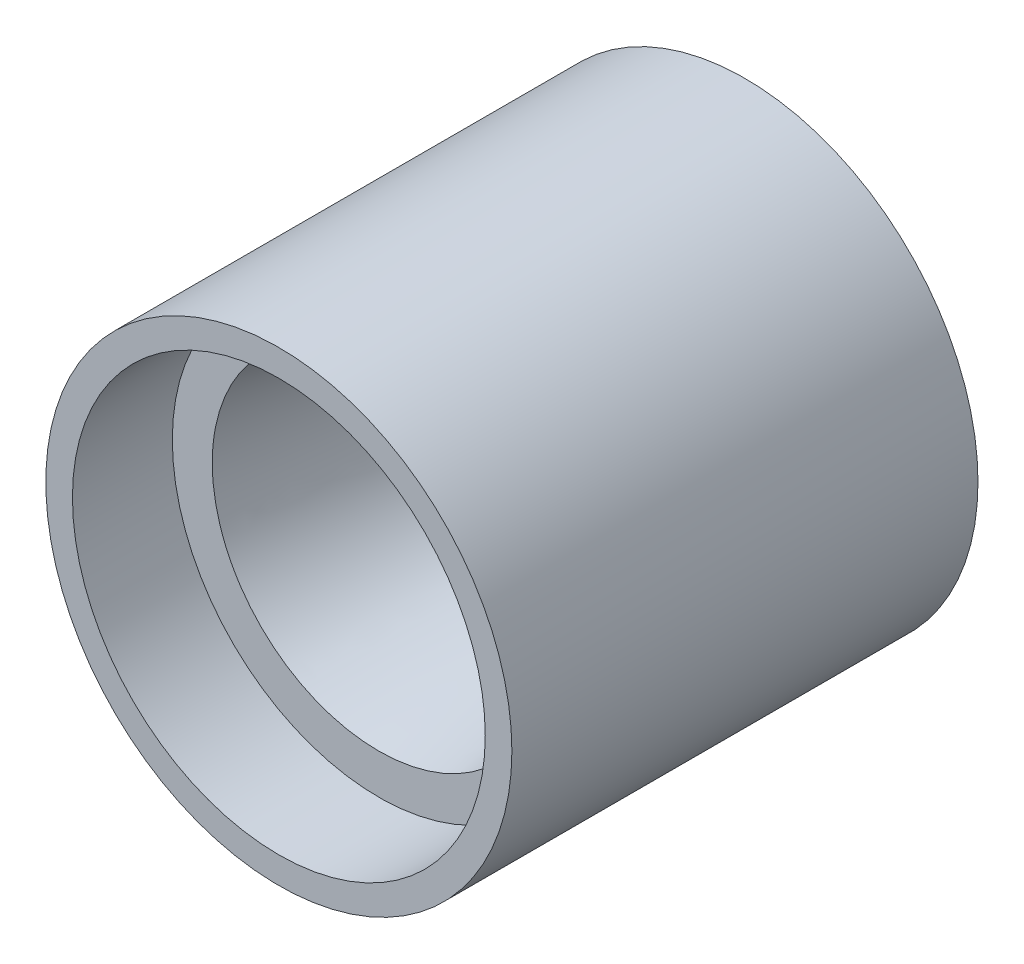
ISO-10303-21;
HEADER;
FILE_DESCRIPTION(('STEP AP214'),'2;1');
FILE_NAME('part.step','',(''),(''),'','','');
FILE_SCHEMA(('AUTOMOTIVE_DESIGN { 1 0 10303 214 1 1 1 1 }'));
ENDSEC;
DATA;
#1=APPLICATION_CONTEXT('core data for automotive mechanical design processes');
#2=APPLICATION_PROTOCOL_DEFINITION('international standard','automotive_design',2000,#1);
#3=PRODUCT_CONTEXT('',#1,'mechanical');
#4=PRODUCT('Part','Part','',(#3));
#5=PRODUCT_RELATED_PRODUCT_CATEGORY('part','',(#4));
#6=PRODUCT_DEFINITION_FORMATION('','',#4);
#7=PRODUCT_DEFINITION_CONTEXT('part definition',#1,'design');
#8=PRODUCT_DEFINITION('design','',#6,#7);
#9=PRODUCT_DEFINITION_SHAPE('','',#8);
#10=(LENGTH_UNIT() NAMED_UNIT(*) SI_UNIT(.MILLI.,.METRE.));
#11=(NAMED_UNIT(*) PLANE_ANGLE_UNIT() SI_UNIT($,.RADIAN.));
#12=(NAMED_UNIT(*) SI_UNIT($,.STERADIAN.) SOLID_ANGLE_UNIT());
#13=UNCERTAINTY_MEASURE_WITH_UNIT(LENGTH_MEASURE(1.E-05),#10,'distance_accuracy_value','');
#14=(GEOMETRIC_REPRESENTATION_CONTEXT(3) GLOBAL_UNCERTAINTY_ASSIGNED_CONTEXT((#13)) GLOBAL_UNIT_ASSIGNED_CONTEXT((#10,
#11,#12)) REPRESENTATION_CONTEXT('',''));
#15=CARTESIAN_POINT('',(0.,0.,0.));
#16=DIRECTION('',(0.,0.,1.));
#17=DIRECTION('',(1.,0.,0.));
#18=AXIS2_PLACEMENT_3D('',#15,#16,#17);
#19=CARTESIAN_POINT('',(0.,0.,70.));
#20=DIRECTION('',(0.,0.,-1.));
#21=DIRECTION('',(-1.,0.,0.));
#22=AXIS2_PLACEMENT_3D('',#19,#20,#21);
#23=CYLINDRICAL_SURFACE('',#22,31.);
#24=CARTESIAN_POINT('',(0.,0.,70.));
#25=DIRECTION('',(0.,0.,1.));
#26=DIRECTION('',(1.,0.,0.));
#27=AXIS2_PLACEMENT_3D('',#24,#25,#26);
#28=CIRCLE('',#27,31.);
#29=CARTESIAN_POINT('',(31.,0.,70.));
#30=VERTEX_POINT('',#29);
#31=EDGE_CURVE('E48',#30,#30,#28,.T.);
#32=ORIENTED_EDGE('',*,*,#31,.T.);
#33=EDGE_LOOP('',(#32));
#34=FACE_BOUND('',#33,.T.);
#35=CARTESIAN_POINT('',(0.,0.,55.));
#36=DIRECTION('',(0.,0.,-1.));
#37=DIRECTION('',(-1.,0.,0.));
#38=AXIS2_PLACEMENT_3D('',#35,#36,#37);
#39=CIRCLE('',#38,31.);
#40=CARTESIAN_POINT('',(-31.,0.,55.));
#41=VERTEX_POINT('',#40);
#42=EDGE_CURVE('E52',#41,#41,#39,.T.);
#43=ORIENTED_EDGE('',*,*,#42,.T.);
#44=EDGE_LOOP('',(#43));
#45=FACE_BOUND('',#44,.T.);
#46=ADVANCED_FACE('F37',(#34,#45),#23,.F.);
#47=CARTESIAN_POINT('',(0.,0.,70.));
#48=DIRECTION('',(0.,0.,1.));
#49=DIRECTION('',(1.,0.,0.));
#50=AXIS2_PLACEMENT_3D('',#47,#48,#49);
#51=PLANE('',#50);
#52=CARTESIAN_POINT('',(0.,0.,70.));
#53=DIRECTION('',(0.,0.,1.));
#54=DIRECTION('',(1.,0.,0.));
#55=AXIS2_PLACEMENT_3D('',#52,#53,#54);
#56=CIRCLE('',#55,35.);
#57=CARTESIAN_POINT('',(35.,0.,70.));
#58=VERTEX_POINT('',#57);
#59=EDGE_CURVE('E11',#58,#58,#56,.T.);
#60=ORIENTED_EDGE('',*,*,#59,.T.);
#61=EDGE_LOOP('',(#60));
#62=FACE_BOUND('',#61,.T.);
#63=ORIENTED_EDGE('',*,*,#31,.F.);
#64=EDGE_LOOP('',(#63));
#65=FACE_BOUND('',#64,.T.);
#66=ADVANCED_FACE('F72',(#62,#65),#51,.T.);
#67=CARTESIAN_POINT('',(0.,0.,0.));
#68=DIRECTION('',(0.,0.,1.));
#69=DIRECTION('',(1.,0.,0.));
#70=AXIS2_PLACEMENT_3D('',#67,#68,#69);
#71=PLANE('',#70);
#72=CARTESIAN_POINT('',(0.,0.,0.));
#73=DIRECTION('',(0.,0.,-1.));
#74=DIRECTION('',(-1.,0.,0.));
#75=AXIS2_PLACEMENT_3D('',#72,#73,#74);
#76=CIRCLE('',#75,19.05);
#77=CARTESIAN_POINT('',(10.5288124830174,15.8759758030005,0.));
#78=VERTEX_POINT('',#77);
#79=EDGE_CURVE('E56',#78,#78,#76,.T.);
#80=ORIENTED_EDGE('',*,*,#79,.F.);
#81=EDGE_LOOP('',(#80));
#82=FACE_BOUND('',#81,.T.);
#83=CARTESIAN_POINT('',(0.,0.,0.));
#84=DIRECTION('',(0.,0.,1.));
#85=DIRECTION('',(1.,0.,0.));
#86=AXIS2_PLACEMENT_3D('',#83,#84,#85);
#87=CIRCLE('',#86,35.);
#88=CARTESIAN_POINT('',(35.,0.,0.));
#89=VERTEX_POINT('',#88);
#90=EDGE_CURVE('E41',#89,#89,#87,.T.);
#91=ORIENTED_EDGE('',*,*,#90,.F.);
#92=EDGE_LOOP('',(#91));
#93=FACE_BOUND('',#92,.T.);
#94=ADVANCED_FACE('F78',(#82,#93),#71,.F.);
#95=CARTESIAN_POINT('',(0.,0.,70.));
#96=DIRECTION('',(0.,0.,-1.));
#97=DIRECTION('',(-1.,0.,0.));
#98=AXIS2_PLACEMENT_3D('',#95,#96,#97);
#99=CYLINDRICAL_SURFACE('',#98,35.);
#100=ORIENTED_EDGE('',*,*,#59,.F.);
#101=EDGE_LOOP('',(#100));
#102=FACE_BOUND('',#101,.T.);
#103=ORIENTED_EDGE('',*,*,#90,.T.);
#104=EDGE_LOOP('',(#103));
#105=FACE_BOUND('',#104,.T.);
#106=ADVANCED_FACE('F39',(#102,#105),#99,.T.);
#107=CARTESIAN_POINT('',(0.,0.,55.));
#108=DIRECTION('',(0.,0.,-1.));
#109=DIRECTION('',(-1.,0.,0.));
#110=AXIS2_PLACEMENT_3D('',#107,#108,#109);
#111=PLANE('',#110);
#112=CARTESIAN_POINT('',(0.,0.,55.));
#113=DIRECTION('',(0.,0.,1.));
#114=DIRECTION('',(1.,0.,0.));
#115=AXIS2_PLACEMENT_3D('',#112,#113,#114);
#116=CIRCLE('',#115,25.);
#117=CARTESIAN_POINT('',(24.5057438966427,4.94656608893074,55.));
#118=VERTEX_POINT('',#117);
#119=EDGE_CURVE('E55',#118,#118,#116,.T.);
#120=ORIENTED_EDGE('',*,*,#119,.F.);
#121=EDGE_LOOP('',(#120));
#122=FACE_BOUND('',#121,.T.);
#123=ORIENTED_EDGE('',*,*,#42,.F.);
#124=EDGE_LOOP('',(#123));
#125=FACE_BOUND('',#124,.T.);
#126=ADVANCED_FACE('F65',(#122,#125),#111,.F.);
#127=CARTESIAN_POINT('',(24.5057438966427,4.94656608893074,55.));
#128=CARTESIAN_POINT('',(10.5288124830174,15.8759758030005,0.));
#129=CARTESIAN_POINT('',(34.3988760745042,-44.0649217043547,55.));
#130=CARTESIAN_POINT('',(42.2807640890183,-5.18164916303433,0.));
#131=CARTESIAN_POINT('',(-14.6126117187812,-53.9580538822161,55.));
#132=CARTESIAN_POINT('',(21.2231391229836,-36.9336007690353,0.));
#133=CARTESIAN_POINT('',(-24.5057438966427,-4.94656608893072,55.));
#134=CARTESIAN_POINT('',(-10.5288124830174,-15.8759758030005,0.));
#135=CARTESIAN_POINT('',(-34.3988760745041,44.0649217043547,55.));
#136=CARTESIAN_POINT('',(-42.2807640890184,5.18164916303432,0.));
#137=CARTESIAN_POINT('',(14.6126117187812,53.9580538822161,55.));
#138=CARTESIAN_POINT('',(-21.2231391229836,36.9336007690353,0.));
#139=CARTESIAN_POINT('',(24.5057438966427,4.94656608893074,55.));
#140=CARTESIAN_POINT('',(10.5288124830174,15.8759758030005,0.));
#141=(BOUNDED_SURFACE() B_SPLINE_SURFACE(3,1,((#127,#128),(#129,#130),(#131,#132),(#133,#134),
(#135,#136),(#137,#138),(#139,#140)),.UNSPECIFIED.,.T.,.F.,.F.) B_SPLINE_SURFACE_WITH_KNOTS((4,
3,4),(2,2),(0.,0.5,1.),(0.,1.),
.UNSPECIFIED.) GEOMETRIC_REPRESENTATION_ITEM() RATIONAL_B_SPLINE_SURFACE(((1.,1.),
(0.333333333333333,0.333333333333334),(0.333333333333333,0.333333333333334),(1.,1.),
(0.333333333333333,0.333333333333333),(0.333333333333333,0.333333333333333),(1.,1.))) REPRESENTATION_ITEM('') SURFACE());
#142=CARTESIAN_POINT('',(24.5057438966427,4.94656608893074,55.));
#143=CARTESIAN_POINT('',(24.3601508610841,5.06041410678563,54.4270833333333));
#144=CARTESIAN_POINT('',(24.2145578255255,5.17426212464053,53.8541666666667));
#145=CARTESIAN_POINT('',(23.9233717544083,5.40195816035031,52.7083333333333));
#146=CARTESIAN_POINT('',(23.7777787188497,5.5158061782052,52.1354166666667));
#147=CARTESIAN_POINT('',(23.4865926477325,5.74350221391499,50.9895833333333));
#148=CARTESIAN_POINT('',(23.3409996121739,5.85735023176988,50.4166666666667));
#149=CARTESIAN_POINT('',(23.0498135410567,6.08504626747967,49.2708333333333));
#150=CARTESIAN_POINT('',(22.9042205054981,6.19889428533456,48.6979166666667));
#151=CARTESIAN_POINT('',(22.6130344343809,6.42659032104435,47.5520833333333));
#152=CARTESIAN_POINT('',(22.4674413988223,6.54043833889924,46.9791666666667));
#153=CARTESIAN_POINT('',(22.1762553277051,6.76813437460903,45.8333333333333));
#154=CARTESIAN_POINT('',(22.0306622921465,6.88198239246392,45.2604166666667));
#155=CARTESIAN_POINT('',(21.7394762210294,7.10967842817371,44.1145833333333));
#156=CARTESIAN_POINT('',(21.5938831854708,7.2235264460286,43.5416666666667));
#157=CARTESIAN_POINT('',(21.3026971143536,7.45122248173839,42.3958333333333));
#158=CARTESIAN_POINT('',(21.157104078795,7.56507049959328,41.8229166666667));
#159=CARTESIAN_POINT('',(20.8659180076778,7.79276653530307,40.6770833333333));
#160=CARTESIAN_POINT('',(20.7203249721192,7.90661455315796,40.1041666666667));
#161=CARTESIAN_POINT('',(20.429138901002,8.13431058886774,38.9583333333333));
#162=CARTESIAN_POINT('',(20.2835458654434,8.24815860672264,38.3854166666667));
#163=CARTESIAN_POINT('',(19.9923597943262,8.47585464243243,37.2395833333333));
#164=CARTESIAN_POINT('',(19.8467667587676,8.58970266028732,36.6666666666667));
#165=CARTESIAN_POINT('',(19.5555806876504,8.8173986959971,35.5208333333333));
#166=CARTESIAN_POINT('',(19.4099876520918,8.931246713852,34.9479166666667));
#167=CARTESIAN_POINT('',(19.1188015809746,9.15894274956178,33.8020833333333));
#168=CARTESIAN_POINT('',(18.973208545416,9.27279076741668,33.2291666666667));
#169=CARTESIAN_POINT('',(18.6820224742988,9.50048680312646,32.0833333333333));
#170=CARTESIAN_POINT('',(18.5364294387402,9.61433482098136,31.5104166666667));
#171=CARTESIAN_POINT('',(18.245243367623,9.84203085669114,30.3645833333333));
#172=CARTESIAN_POINT('',(18.0996503320644,9.95587887454604,29.7916666666667));
#173=CARTESIAN_POINT('',(17.8084642609472,10.1835749102558,28.6458333333333));
#174=CARTESIAN_POINT('',(17.6628712253886,10.2974229281107,28.0729166666667));
#175=CARTESIAN_POINT('',(17.3716851542715,10.5251189638205,26.9270833333333));
#176=CARTESIAN_POINT('',(17.2260921187129,10.6389669816754,26.3541666666667));
#177=CARTESIAN_POINT('',(16.9349060475957,10.8666630173852,25.2083333333333));
#178=CARTESIAN_POINT('',(16.7893130120371,10.9805110352401,24.6354166666667));
#179=CARTESIAN_POINT('',(16.4981269409199,11.2082070709499,23.4895833333333));
#180=CARTESIAN_POINT('',(16.3525339053613,11.3220550888048,22.9166666666667));
#181=CARTESIAN_POINT('',(16.0613478342441,11.5497511245145,21.7708333333333));
#182=CARTESIAN_POINT('',(15.9157547986855,11.6635991423694,21.1979166666667));
#183=CARTESIAN_POINT('',(15.6245687275683,11.8912951780792,20.0520833333333));
#184=CARTESIAN_POINT('',(15.4789756920097,12.0051431959341,19.4791666666667));
#185=CARTESIAN_POINT('',(15.1877896208925,12.2328392316439,18.3333333333333));
#186=CARTESIAN_POINT('',(15.0421965853339,12.3466872494988,17.7604166666667));
#187=CARTESIAN_POINT('',(14.7510105142167,12.5743832852086,16.6145833333333));
#188=CARTESIAN_POINT('',(14.6054174786581,12.6882313030635,16.0416666666667));
#189=CARTESIAN_POINT('',(14.3142314075409,12.9159273387733,14.8958333333333));
#190=CARTESIAN_POINT('',(14.1686383719823,13.0297753566282,14.3229166666667));
#191=CARTESIAN_POINT('',(13.8774523008651,13.2574713923379,13.1770833333333));
#192=CARTESIAN_POINT('',(13.7318592653065,13.3713194101928,12.6041666666667));
#193=CARTESIAN_POINT('',(13.4406731941893,13.5990154459026,11.4583333333333));
#194=CARTESIAN_POINT('',(13.2950801586307,13.7128634637575,10.8854166666667));
#195=CARTESIAN_POINT('',(13.0038940875136,13.9405594994673,9.73958333333333));
#196=CARTESIAN_POINT('',(12.858301051955,14.0544075173222,9.16666666666667));
#197=CARTESIAN_POINT('',(12.5671149808378,14.282103553032,8.02083333333333));
#198=CARTESIAN_POINT('',(12.4215219452792,14.3959515708869,7.44791666666667));
#199=CARTESIAN_POINT('',(12.130335874162,14.6236476065967,6.30208333333333));
#200=CARTESIAN_POINT('',(11.9847428386034,14.7374956244515,5.72916666666667));
#201=CARTESIAN_POINT('',(11.6935567674862,14.9651916601613,4.58333333333333));
#202=CARTESIAN_POINT('',(11.5479637319276,15.0790396780162,4.01041666666667));
#203=CARTESIAN_POINT('',(11.2567776608104,15.306735713726,2.86458333333333));
#204=CARTESIAN_POINT('',(11.1111846252518,15.4205837315809,2.29166666666667));
#205=CARTESIAN_POINT('',(10.8199985541346,15.6482797672907,1.14583333333333));
#206=CARTESIAN_POINT('',(10.674405518576,15.7621277851456,0.572916666666668));
#207=CARTESIAN_POINT('',(10.5288124830174,15.8759758030005,0.));
#208=B_SPLINE_CURVE_WITH_KNOTS('',3,(#142,#143,#144,#145,#146,#147,#148,#149,#150,#151,#152,
#153,#154,#155,#156,#157,#158,#159,#160,#161,#162,#163,#164,#165,#166,#167,#168,#169,#170,#171,
#172,#173,#174,#175,#176,#177,#178,#179,#180,#181,#182,#183,#184,#185,#186,#187,#188,#189,#190,
#191,#192,#193,#194,#195,#196,#197,#198,#199,#200,#201,#202,#203,#204,#205,#206,#207),
.UNSPECIFIED.,.F.,.F.,(4,2,2,2,2,2,2,2,2,2,2,2,2,2,2,2,2,2,2,2,2,2,2,2,2,2,2,2,2,2,2,2,4),(0.,
1.80597062297643,3.61194124595287,5.41791186892931,7.22388249190574,9.02985311488217,
10.8358237378586,12.641794360835,14.4477649838115,16.2537356067879,18.0597062297644,
19.8656768527408,21.6716474757172,23.4776180986937,25.2835887216701,27.0895593446465,
28.895529967623,30.7015005905994,32.5074712135758,34.3134418365523,36.1194124595287,
37.9253830825051,39.7313537054816,41.537324328458,43.3432949514345,45.1492655744109,
46.9552361973873,48.7612068203638,50.5671774433402,52.3731480663166,54.1791186892931,
55.9850893122695,57.791059935246),.UNSPECIFIED.);
#209=EDGE_CURVE('BSEAM62',#118,#78,#208,.T.);
#210=ORIENTED_EDGE('',*,*,#119,.T.);
#211=ORIENTED_EDGE('',*,*,#79,.T.);
#212=ORIENTED_EDGE('',*,*,#209,.T.);
#213=ORIENTED_EDGE('',*,*,#209,.F.);
#214=EDGE_LOOP('',(#210,#212,#211,#213));
#215=FACE_BOUND('',#214,.T.);
#216=ADVANCED_FACE('F62',(#215),#141,.F.);
#217=CLOSED_SHELL('',(#46,#66,#94,#106,#126,#216));
#218=MANIFOLD_SOLID_BREP('B2',#217);
#219=ADVANCED_BREP_SHAPE_REPRESENTATION('',(#18,#218),#14);
#220=SHAPE_DEFINITION_REPRESENTATION(#9,#219);
ENDSEC;
END-ISO-10303-21;
